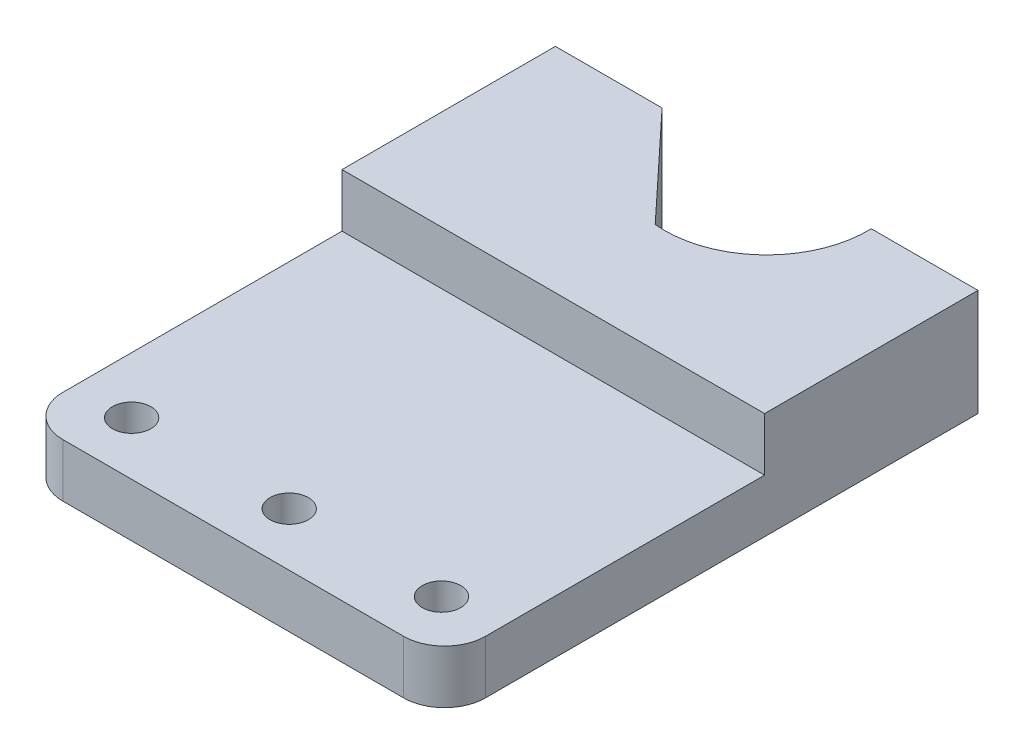
ISO-10303-21;
HEADER;
FILE_DESCRIPTION(('STEP AP214'),'2;1');
FILE_NAME('part.step','',(''),(''),'','','');
FILE_SCHEMA(('AUTOMOTIVE_DESIGN { 1 0 10303 214 1 1 1 1 }'));
ENDSEC;
DATA;
#1=APPLICATION_CONTEXT('core data for automotive mechanical design processes');
#2=APPLICATION_PROTOCOL_DEFINITION('international standard','automotive_design',2000,#1);
#3=PRODUCT_CONTEXT('',#1,'mechanical');
#4=PRODUCT('Part','Part','',(#3));
#5=PRODUCT_RELATED_PRODUCT_CATEGORY('part','',(#4));
#6=PRODUCT_DEFINITION_FORMATION('','',#4);
#7=PRODUCT_DEFINITION_CONTEXT('part definition',#1,'design');
#8=PRODUCT_DEFINITION('design','',#6,#7);
#9=PRODUCT_DEFINITION_SHAPE('','',#8);
#10=(LENGTH_UNIT() NAMED_UNIT(*) SI_UNIT(.MILLI.,.METRE.));
#11=(NAMED_UNIT(*) PLANE_ANGLE_UNIT() SI_UNIT($,.RADIAN.));
#12=(NAMED_UNIT(*) SI_UNIT($,.STERADIAN.) SOLID_ANGLE_UNIT());
#13=UNCERTAINTY_MEASURE_WITH_UNIT(LENGTH_MEASURE(1.E-05),#10,'distance_accuracy_value','');
#14=(GEOMETRIC_REPRESENTATION_CONTEXT(3) GLOBAL_UNCERTAINTY_ASSIGNED_CONTEXT((#13)) GLOBAL_UNIT_ASSIGNED_CONTEXT((#10,
#11,#12)) REPRESENTATION_CONTEXT('',''));
#15=CARTESIAN_POINT('',(0.,0.,0.));
#16=DIRECTION('',(0.,0.,1.));
#17=DIRECTION('',(1.,0.,0.));
#18=AXIS2_PLACEMENT_3D('',#15,#16,#17);
#19=CARTESIAN_POINT('',(-259.020883507789,12.7,-132.766492393178));
#20=DIRECTION('',(0.,-1.,0.));
#21=DIRECTION('',(0.,0.,-1.));
#22=AXIS2_PLACEMENT_3D('',#19,#20,#21);
#23=CYLINDRICAL_SURFACE('',#22,4.87);
#24=DIRECTION('',(0.,-1.,0.));
#25=VECTOR('',#24,1.);
#26=CARTESIAN_POINT('',(-254.150883507789,12.7,-132.766492393178));
#27=LINE('',#26,#25);
#28=CARTESIAN_POINT('',(-254.150883507789,6.35,-132.766492393178));
#29=VERTEX_POINT('',#28);
#30=CARTESIAN_POINT('',(-254.150883507789,0.,-132.766492393178));
#31=VERTEX_POINT('',#30);
#32=EDGE_CURVE('E225',#29,#31,#27,.T.);
#33=ORIENTED_EDGE('',*,*,#32,.F.);
#34=CARTESIAN_POINT('',(-259.020883507789,6.35,-132.766492393178));
#35=DIRECTION('',(0.,1.,0.));
#36=DIRECTION('',(0.,0.,1.));
#37=AXIS2_PLACEMENT_3D('',#34,#35,#36);
#38=CIRCLE('',#37,4.87);
#39=CARTESIAN_POINT('',(-259.020883507789,6.35,-127.896492393178));
#40=VERTEX_POINT('',#39);
#41=EDGE_CURVE('E48',#29,#40,#38,.F.);
#42=ORIENTED_EDGE('',*,*,#41,.T.);
#43=DIRECTION('',(0.,-1.,0.));
#44=VECTOR('',#43,1.);
#45=CARTESIAN_POINT('',(-259.020883507789,12.7,-127.896492393178));
#46=LINE('',#45,#44);
#47=CARTESIAN_POINT('',(-259.020883507789,0.,-127.896492393178));
#48=VERTEX_POINT('',#47);
#49=EDGE_CURVE('E41',#48,#40,#46,.F.);
#50=ORIENTED_EDGE('',*,*,#49,.F.);
#51=CARTESIAN_POINT('',(-259.020883507789,0.,-132.766492393178));
#52=DIRECTION('',(0.,1.,0.));
#53=DIRECTION('',(0.,0.,1.));
#54=AXIS2_PLACEMENT_3D('',#51,#52,#53);
#55=CIRCLE('',#54,4.87);
#56=EDGE_CURVE('E11',#31,#48,#55,.F.);
#57=ORIENTED_EDGE('',*,*,#56,.F.);
#58=EDGE_LOOP('',(#33,#42,#50,#57));
#59=FACE_BOUND('',#58,.T.);
#60=ADVANCED_FACE('F33',(#59),#23,.T.);
#61=CARTESIAN_POINT('',(-299.585501553445,12.7,-132.766492393178));
#62=DIRECTION('',(0.,1.,0.));
#63=DIRECTION('',(0.,0.,1.));
#64=AXIS2_PLACEMENT_3D('',#61,#62,#63);
#65=CYLINDRICAL_SURFACE('',#64,4.87);
#66=DIRECTION('',(0.,1.,0.));
#67=VECTOR('',#66,1.);
#68=CARTESIAN_POINT('',(-299.585501553445,12.7,-127.896492393178));
#69=LINE('',#68,#67);
#70=CARTESIAN_POINT('',(-299.585501553445,6.35,-127.896492393178));
#71=VERTEX_POINT('',#70);
#72=CARTESIAN_POINT('',(-299.585501553445,0.,-127.896492393178));
#73=VERTEX_POINT('',#72);
#74=EDGE_CURVE('E221',#71,#73,#69,.F.);
#75=ORIENTED_EDGE('',*,*,#74,.F.);
#76=CARTESIAN_POINT('',(-299.585501553445,6.35,-132.766492393178));
#77=DIRECTION('',(0.,1.,0.));
#78=DIRECTION('',(0.,0.,1.));
#79=AXIS2_PLACEMENT_3D('',#76,#77,#78);
#80=CIRCLE('',#79,4.87);
#81=CARTESIAN_POINT('',(-304.455501553445,6.35,-132.766492393178));
#82=VERTEX_POINT('',#81);
#83=EDGE_CURVE('E148',#71,#82,#80,.F.);
#84=ORIENTED_EDGE('',*,*,#83,.T.);
#85=DIRECTION('',(0.,1.,0.));
#86=VECTOR('',#85,1.);
#87=CARTESIAN_POINT('',(-304.455501553445,12.7,-132.766492393178));
#88=LINE('',#87,#86);
#89=CARTESIAN_POINT('',(-304.455501553445,0.,-132.766492393178));
#90=VERTEX_POINT('',#89);
#91=EDGE_CURVE('E218',#90,#82,#88,.T.);
#92=ORIENTED_EDGE('',*,*,#91,.F.);
#93=CARTESIAN_POINT('',(-299.585501553445,0.,-132.766492393178));
#94=DIRECTION('',(0.,1.,0.));
#95=DIRECTION('',(0.,0.,1.));
#96=AXIS2_PLACEMENT_3D('',#93,#94,#95);
#97=CIRCLE('',#96,4.87);
#98=EDGE_CURVE('E223',#73,#90,#97,.F.);
#99=ORIENTED_EDGE('',*,*,#98,.F.);
#100=EDGE_LOOP('',(#75,#84,#92,#99));
#101=FACE_BOUND('',#100,.T.);
#102=ADVANCED_FACE('F259',(#101),#65,.T.);
#103=CARTESIAN_POINT('',(-304.455501553445,12.7,-127.896492393178));
#104=DIRECTION('',(0.,0.,-1.));
#105=DIRECTION('',(-1.,0.,0.));
#106=AXIS2_PLACEMENT_3D('',#103,#104,#105);
#107=PLANE('',#106);
#108=DIRECTION('',(1.,0.,0.));
#109=VECTOR('',#108,1.);
#110=CARTESIAN_POINT('',(-304.455501553445,6.35,-127.896492393178));
#111=LINE('',#110,#109);
#112=EDGE_CURVE('E136',#71,#40,#111,.T.);
#113=ORIENTED_EDGE('',*,*,#112,.F.);
#114=ORIENTED_EDGE('',*,*,#74,.T.);
#115=DIRECTION('',(1.,0.,0.));
#116=VECTOR('',#115,1.);
#117=CARTESIAN_POINT('',(-304.455501553445,0.,-127.896492393178));
#118=LINE('',#117,#116);
#119=EDGE_CURVE('E194',#73,#48,#118,.T.);
#120=ORIENTED_EDGE('',*,*,#119,.T.);
#121=ORIENTED_EDGE('',*,*,#49,.T.);
#122=EDGE_LOOP('',(#113,#114,#120,#121));
#123=FACE_BOUND('',#122,.T.);
#124=ADVANCED_FACE('F230',(#123),#107,.F.);
#125=CARTESIAN_POINT('',(-297.746130931016,12.7,-134.246492393178));
#126=DIRECTION('',(0.,-1.,0.));
#127=DIRECTION('',(0.,0.,-1.));
#128=AXIS2_PLACEMENT_3D('',#125,#126,#127);
#129=CYLINDRICAL_SURFACE('',#128,2.28600000000004);
#130=CARTESIAN_POINT('',(-297.746130931016,0.,-134.246492393178));
#131=DIRECTION('',(0.,1.,0.));
#132=DIRECTION('',(0.,0.,1.));
#133=AXIS2_PLACEMENT_3D('',#130,#131,#132);
#134=CIRCLE('',#133,2.28600000000004);
#135=CARTESIAN_POINT('',(-297.746130931016,0.,-131.960492393178));
#136=VERTEX_POINT('',#135);
#137=EDGE_CURVE('E170',#136,#136,#134,.T.);
#138=ORIENTED_EDGE('',*,*,#137,.F.);
#139=EDGE_LOOP('',(#138));
#140=FACE_BOUND('',#139,.T.);
#141=CARTESIAN_POINT('',(-297.746130931016,6.35,-134.246492393178));
#142=DIRECTION('',(0.,1.,0.));
#143=DIRECTION('',(0.,0.,1.));
#144=AXIS2_PLACEMENT_3D('',#141,#142,#143);
#145=CIRCLE('',#144,2.28600000000004);
#146=CARTESIAN_POINT('',(-297.746130931016,6.35,-131.960492393178));
#147=VERTEX_POINT('',#146);
#148=EDGE_CURVE('E145',#147,#147,#145,.T.);
#149=ORIENTED_EDGE('',*,*,#148,.T.);
#150=EDGE_LOOP('',(#149));
#151=FACE_BOUND('',#150,.T.);
#152=ADVANCED_FACE('F281',(#140,#151),#129,.F.);
#153=CARTESIAN_POINT('',(-278.990383135221,12.7,-134.246492393178));
#154=DIRECTION('',(0.,-1.,0.));
#155=DIRECTION('',(0.,0.,-1.));
#156=AXIS2_PLACEMENT_3D('',#153,#154,#155);
#157=CYLINDRICAL_SURFACE('',#156,2.28600000000028);
#158=CARTESIAN_POINT('',(-278.990383135221,0.,-134.246492393178));
#159=DIRECTION('',(0.,1.,0.));
#160=DIRECTION('',(0.,0.,1.));
#161=AXIS2_PLACEMENT_3D('',#158,#159,#160);
#162=CIRCLE('',#161,2.28600000000028);
#163=CARTESIAN_POINT('',(-278.990383135221,0.,-131.960492393178));
#164=VERTEX_POINT('',#163);
#165=EDGE_CURVE('E167',#164,#164,#162,.T.);
#166=ORIENTED_EDGE('',*,*,#165,.F.);
#167=EDGE_LOOP('',(#166));
#168=FACE_BOUND('',#167,.T.);
#169=CARTESIAN_POINT('',(-278.990383135221,6.35,-134.246492393178));
#170=DIRECTION('',(0.,1.,0.));
#171=DIRECTION('',(0.,0.,1.));
#172=AXIS2_PLACEMENT_3D('',#169,#170,#171);
#173=CIRCLE('',#172,2.28600000000028);
#174=CARTESIAN_POINT('',(-278.990383135221,6.35,-131.960492393178));
#175=VERTEX_POINT('',#174);
#176=EDGE_CURVE('E142',#175,#175,#173,.T.);
#177=ORIENTED_EDGE('',*,*,#176,.T.);
#178=EDGE_LOOP('',(#177));
#179=FACE_BOUND('',#178,.T.);
#180=ADVANCED_FACE('F286',(#168,#179),#157,.F.);
#181=CARTESIAN_POINT('',(-260.860254130218,12.7,-134.246492393178));
#182=DIRECTION('',(0.,-1.,0.));
#183=DIRECTION('',(0.,0.,-1.));
#184=AXIS2_PLACEMENT_3D('',#181,#182,#183);
#185=CYLINDRICAL_SURFACE('',#184,2.2860000000005);
#186=CARTESIAN_POINT('',(-260.860254130218,0.,-134.246492393178));
#187=DIRECTION('',(0.,1.,0.));
#188=DIRECTION('',(0.,0.,1.));
#189=AXIS2_PLACEMENT_3D('',#186,#187,#188);
#190=CIRCLE('',#189,2.2860000000005);
#191=CARTESIAN_POINT('',(-260.860254130218,0.,-131.960492393178));
#192=VERTEX_POINT('',#191);
#193=EDGE_CURVE('E156',#192,#192,#190,.T.);
#194=ORIENTED_EDGE('',*,*,#193,.F.);
#195=EDGE_LOOP('',(#194));
#196=FACE_BOUND('',#195,.T.);
#197=CARTESIAN_POINT('',(-260.860254130218,6.35,-134.246492393178));
#198=DIRECTION('',(0.,1.,0.));
#199=DIRECTION('',(0.,0.,1.));
#200=AXIS2_PLACEMENT_3D('',#197,#198,#199);
#201=CIRCLE('',#200,2.2860000000005);
#202=CARTESIAN_POINT('',(-260.860254130218,6.35,-131.960492393178));
#203=VERTEX_POINT('',#202);
#204=EDGE_CURVE('E36',#203,#203,#201,.T.);
#205=ORIENTED_EDGE('',*,*,#204,.T.);
#206=EDGE_LOOP('',(#205));
#207=FACE_BOUND('',#206,.T.);
#208=ADVANCED_FACE('F301',(#196,#207),#185,.F.);
#209=CARTESIAN_POINT('',(-278.944798511906,12.7,-191.012799973147));
#210=DIRECTION('',(0.,1.,0.));
#211=DIRECTION('',(0.,0.,1.));
#212=AXIS2_PLACEMENT_3D('',#209,#210,#211);
#213=PLANE('',#212);
#214=DIRECTION('',(-1.,0.,0.));
#215=VECTOR('',#214,1.);
#216=CARTESIAN_POINT('',(-254.150883507789,12.7,-165.996492393178));
#217=LINE('',#216,#215);
#218=CARTESIAN_POINT('',(-254.150883507789,12.7,-165.996492393178));
#219=VERTEX_POINT('',#218);
#220=CARTESIAN_POINT('',(-304.455501553445,12.7,-165.996492393178));
#221=VERTEX_POINT('',#220);
#222=EDGE_CURVE('E122',#219,#221,#217,.T.);
#223=ORIENTED_EDGE('',*,*,#222,.F.);
#224=DIRECTION('',(0.,0.,-1.));
#225=VECTOR('',#224,1.);
#226=CARTESIAN_POINT('',(-254.150883507789,12.7,-127.896492393178));
#227=LINE('',#226,#225);
#228=CARTESIAN_POINT('',(-254.150883507789,12.7,-191.396492393178));
#229=VERTEX_POINT('',#228);
#230=EDGE_CURVE('E135',#219,#229,#227,.T.);
#231=ORIENTED_EDGE('',*,*,#230,.T.);
#232=DIRECTION('',(-1.,0.,0.));
#233=VECTOR('',#232,1.);
#234=CARTESIAN_POINT('',(-266.850883507789,12.7,-191.396492393178));
#235=LINE('',#234,#233);
#236=CARTESIAN_POINT('',(-266.850883507789,12.7,-191.396492393178));
#237=VERTEX_POINT('',#236);
#238=EDGE_CURVE('E182',#229,#237,#235,.T.);
#239=ORIENTED_EDGE('',*,*,#238,.T.);
#240=CARTESIAN_POINT('',(-278.944798511906,12.7,-191.012799973147));
#241=DIRECTION('',(0.,-1.,0.));
#242=DIRECTION('',(0.,0.,1.));
#243=AXIS2_PLACEMENT_3D('',#240,#241,#242);
#244=CIRCLE('',#243,12.1);
#245=CARTESIAN_POINT('',(-280.151228021918,12.7,-178.97309367119));
#246=VERTEX_POINT('',#245);
#247=EDGE_CURVE('E184',#237,#246,#244,.T.);
#248=ORIENTED_EDGE('',*,*,#247,.T.);
#249=DIRECTION('',(-0.682604325383957,0.,-0.730788160116948));
#250=VECTOR('',#249,1.);
#251=CARTESIAN_POINT('',(-291.755501553445,12.7,-191.396492393178));
#252=LINE('',#251,#250);
#253=CARTESIAN_POINT('',(-291.755501553445,12.7,-191.396492393178));
#254=VERTEX_POINT('',#253);
#255=EDGE_CURVE('E186',#246,#254,#252,.T.);
#256=ORIENTED_EDGE('',*,*,#255,.T.);
#257=DIRECTION('',(-1.,0.,0.));
#258=VECTOR('',#257,1.);
#259=CARTESIAN_POINT('',(-291.755501553445,12.7,-191.396492393178));
#260=LINE('',#259,#258);
#261=CARTESIAN_POINT('',(-304.455501553445,12.7,-191.396492393178));
#262=VERTEX_POINT('',#261);
#263=EDGE_CURVE('E174',#254,#262,#260,.T.);
#264=ORIENTED_EDGE('',*,*,#263,.T.);
#265=DIRECTION('',(0.,0.,1.));
#266=VECTOR('',#265,1.);
#267=CARTESIAN_POINT('',(-304.455501553445,12.7,-191.396492393178));
#268=LINE('',#267,#266);
#269=EDGE_CURVE('E177',#262,#221,#268,.T.);
#270=ORIENTED_EDGE('',*,*,#269,.T.);
#271=EDGE_LOOP('',(#223,#231,#239,#248,#256,#264,#270));
#272=FACE_BOUND('',#271,.T.);
#273=ADVANCED_FACE('F253',(#272),#213,.T.);
#274=CARTESIAN_POINT('',(-278.944798511906,0.,-191.012799973147));
#275=DIRECTION('',(0.,1.,0.));
#276=DIRECTION('',(0.,0.,1.));
#277=AXIS2_PLACEMENT_3D('',#274,#275,#276);
#278=PLANE('',#277);
#279=DIRECTION('',(0.,0.,-1.));
#280=VECTOR('',#279,1.);
#281=CARTESIAN_POINT('',(-254.150883507789,0.,-127.896492393178));
#282=LINE('',#281,#280);
#283=CARTESIAN_POINT('',(-254.150883507789,0.,-191.396492393178));
#284=VERTEX_POINT('',#283);
#285=EDGE_CURVE('E197',#31,#284,#282,.T.);
#286=ORIENTED_EDGE('',*,*,#285,.F.);
#287=ORIENTED_EDGE('',*,*,#56,.T.);
#288=ORIENTED_EDGE('',*,*,#119,.F.);
#289=ORIENTED_EDGE('',*,*,#98,.T.);
#290=DIRECTION('',(0.,0.,1.));
#291=VECTOR('',#290,1.);
#292=CARTESIAN_POINT('',(-304.455501553445,0.,-191.396492393178));
#293=LINE('',#292,#291);
#294=CARTESIAN_POINT('',(-304.455501553445,0.,-191.396492393178));
#295=VERTEX_POINT('',#294);
#296=EDGE_CURVE('E191',#295,#90,#293,.T.);
#297=ORIENTED_EDGE('',*,*,#296,.F.);
#298=DIRECTION('',(-1.,0.,0.));
#299=VECTOR('',#298,1.);
#300=CARTESIAN_POINT('',(-291.755501553445,0.,-191.396492393178));
#301=LINE('',#300,#299);
#302=CARTESIAN_POINT('',(-291.755501553445,0.,-191.396492393178));
#303=VERTEX_POINT('',#302);
#304=EDGE_CURVE('E173',#303,#295,#301,.T.);
#305=ORIENTED_EDGE('',*,*,#304,.F.);
#306=DIRECTION('',(-0.682604325383957,0.,-0.730788160116948));
#307=VECTOR('',#306,1.);
#308=CARTESIAN_POINT('',(-291.755501553445,0.,-191.396492393178));
#309=LINE('',#308,#307);
#310=CARTESIAN_POINT('',(-280.151228021918,0.,-178.97309367119));
#311=VERTEX_POINT('',#310);
#312=EDGE_CURVE('E178',#311,#303,#309,.T.);
#313=ORIENTED_EDGE('',*,*,#312,.F.);
#314=CARTESIAN_POINT('',(-278.944798511906,0.,-191.012799973147));
#315=DIRECTION('',(0.,-1.,0.));
#316=DIRECTION('',(0.,0.,1.));
#317=AXIS2_PLACEMENT_3D('',#314,#315,#316);
#318=CIRCLE('',#317,12.1);
#319=CARTESIAN_POINT('',(-266.850883507789,0.,-191.396492393178));
#320=VERTEX_POINT('',#319);
#321=EDGE_CURVE('E201',#320,#311,#318,.T.);
#322=ORIENTED_EDGE('',*,*,#321,.F.);
#323=DIRECTION('',(-1.,0.,0.));
#324=VECTOR('',#323,1.);
#325=CARTESIAN_POINT('',(-266.850883507789,0.,-191.396492393178));
#326=LINE('',#325,#324);
#327=EDGE_CURVE('E199',#284,#320,#326,.T.);
#328=ORIENTED_EDGE('',*,*,#327,.F.);
#329=EDGE_LOOP('',(#286,#287,#288,#289,#297,#305,#313,#322,#328));
#330=FACE_BOUND('',#329,.T.);
#331=ORIENTED_EDGE('',*,*,#137,.T.);
#332=EDGE_LOOP('',(#331));
#333=FACE_BOUND('',#332,.T.);
#334=ORIENTED_EDGE('',*,*,#165,.T.);
#335=EDGE_LOOP('',(#334));
#336=FACE_BOUND('',#335,.T.);
#337=ORIENTED_EDGE('',*,*,#193,.T.);
#338=EDGE_LOOP('',(#337));
#339=FACE_BOUND('',#338,.T.);
#340=ADVANCED_FACE('F239',(#330,#333,#336,#339),#278,.F.);
#341=CARTESIAN_POINT('',(-291.755501553445,12.7,-191.396492393178));
#342=DIRECTION('',(0.,0.,1.));
#343=DIRECTION('',(1.,0.,0.));
#344=AXIS2_PLACEMENT_3D('',#341,#342,#343);
#345=PLANE('',#344);
#346=CARTESIAN_POINT('',(-298.105501553445,6.35,-191.396492393178));
#347=DIRECTION('',(0.,0.,-1.));
#348=DIRECTION('',(-1.,0.,0.));
#349=AXIS2_PLACEMENT_3D('',#346,#347,#348);
#350=CIRCLE('',#349,2.28600000000004);
#351=CARTESIAN_POINT('',(-300.391501553445,6.35,-191.396492393178));
#352=VERTEX_POINT('',#351);
#353=EDGE_CURVE('E152',#352,#352,#350,.T.);
#354=ORIENTED_EDGE('',*,*,#353,.F.);
#355=EDGE_LOOP('',(#354));
#356=FACE_BOUND('',#355,.T.);
#357=ORIENTED_EDGE('',*,*,#304,.T.);
#358=DIRECTION('',(0.,-1.,0.));
#359=VECTOR('',#358,1.);
#360=CARTESIAN_POINT('',(-304.455501553445,12.7,-191.396492393178));
#361=LINE('',#360,#359);
#362=EDGE_CURVE('E215',#262,#295,#361,.T.);
#363=ORIENTED_EDGE('',*,*,#362,.F.);
#364=ORIENTED_EDGE('',*,*,#263,.F.);
#365=DIRECTION('',(0.,-1.,0.));
#366=VECTOR('',#365,1.);
#367=CARTESIAN_POINT('',(-291.755501553445,12.7,-191.396492393178));
#368=LINE('',#367,#366);
#369=EDGE_CURVE('E188',#254,#303,#368,.T.);
#370=ORIENTED_EDGE('',*,*,#369,.T.);
#371=EDGE_LOOP('',(#357,#363,#364,#370));
#372=FACE_BOUND('',#371,.T.);
#373=ADVANCED_FACE('F263',(#356,#372),#345,.F.);
#374=CARTESIAN_POINT('',(-304.455501553445,12.7,-191.396492393178));
#375=DIRECTION('',(1.,0.,0.));
#376=DIRECTION('',(0.,0.,-1.));
#377=AXIS2_PLACEMENT_3D('',#374,#375,#376);
#378=PLANE('',#377);
#379=DIRECTION('',(0.,0.,1.));
#380=VECTOR('',#379,1.);
#381=CARTESIAN_POINT('',(-304.455501553445,6.35,-165.996492393178));
#382=LINE('',#381,#380);
#383=CARTESIAN_POINT('',(-304.455501553445,6.35,-165.996492393178));
#384=VERTEX_POINT('',#383);
#385=EDGE_CURVE('E130',#384,#82,#382,.T.);
#386=ORIENTED_EDGE('',*,*,#385,.F.);
#387=DIRECTION('',(0.,1.,0.));
#388=VECTOR('',#387,1.);
#389=CARTESIAN_POINT('',(-304.455501553445,6.35,-165.996492393178));
#390=LINE('',#389,#388);
#391=EDGE_CURVE('E129',#384,#221,#390,.T.);
#392=ORIENTED_EDGE('',*,*,#391,.T.);
#393=ORIENTED_EDGE('',*,*,#269,.F.);
#394=ORIENTED_EDGE('',*,*,#362,.T.);
#395=ORIENTED_EDGE('',*,*,#296,.T.);
#396=ORIENTED_EDGE('',*,*,#91,.T.);
#397=EDGE_LOOP('',(#386,#392,#393,#394,#395,#396));
#398=FACE_BOUND('',#397,.T.);
#399=ADVANCED_FACE('F261',(#398),#378,.F.);
#400=CARTESIAN_POINT('',(-254.150883507789,12.7,-127.896492393178));
#401=DIRECTION('',(-1.,0.,0.));
#402=DIRECTION('',(0.,0.,1.));
#403=AXIS2_PLACEMENT_3D('',#400,#401,#402);
#404=PLANE('',#403);
#405=ORIENTED_EDGE('',*,*,#230,.F.);
#406=DIRECTION('',(0.,1.,0.));
#407=VECTOR('',#406,1.);
#408=CARTESIAN_POINT('',(-254.150883507789,6.35,-165.996492393178));
#409=LINE('',#408,#407);
#410=CARTESIAN_POINT('',(-254.150883507789,6.35,-165.996492393178));
#411=VERTEX_POINT('',#410);
#412=EDGE_CURVE('E126',#411,#219,#409,.T.);
#413=ORIENTED_EDGE('',*,*,#412,.F.);
#414=DIRECTION('',(0.,0.,-1.));
#415=VECTOR('',#414,1.);
#416=CARTESIAN_POINT('',(-254.150883507789,6.35,-127.896492393178));
#417=LINE('',#416,#415);
#418=EDGE_CURVE('E114',#29,#411,#417,.T.);
#419=ORIENTED_EDGE('',*,*,#418,.F.);
#420=ORIENTED_EDGE('',*,*,#32,.T.);
#421=ORIENTED_EDGE('',*,*,#285,.T.);
#422=DIRECTION('',(0.,-1.,0.));
#423=VECTOR('',#422,1.);
#424=CARTESIAN_POINT('',(-254.150883507789,12.7,-191.396492393178));
#425=LINE('',#424,#423);
#426=EDGE_CURVE('E212',#229,#284,#425,.T.);
#427=ORIENTED_EDGE('',*,*,#426,.F.);
#428=EDGE_LOOP('',(#405,#413,#419,#420,#421,#427));
#429=FACE_BOUND('',#428,.T.);
#430=ADVANCED_FACE('F133',(#429),#404,.F.);
#431=CARTESIAN_POINT('',(-266.850883507789,12.7,-191.396492393178));
#432=DIRECTION('',(0.,0.,1.));
#433=DIRECTION('',(1.,0.,0.));
#434=AXIS2_PLACEMENT_3D('',#431,#432,#433);
#435=PLANE('',#434);
#436=CARTESIAN_POINT('',(-260.500883507789,6.35,-191.396492393178));
#437=DIRECTION('',(0.,0.,-1.));
#438=DIRECTION('',(-1.,0.,0.));
#439=AXIS2_PLACEMENT_3D('',#436,#437,#438);
#440=CIRCLE('',#439,2.28600000000004);
#441=CARTESIAN_POINT('',(-262.786883507789,6.35,-191.396492393178));
#442=VERTEX_POINT('',#441);
#443=EDGE_CURVE('E157',#442,#442,#440,.T.);
#444=ORIENTED_EDGE('',*,*,#443,.F.);
#445=EDGE_LOOP('',(#444));
#446=FACE_BOUND('',#445,.T.);
#447=ORIENTED_EDGE('',*,*,#327,.T.);
#448=DIRECTION('',(0.,-1.,0.));
#449=VECTOR('',#448,1.);
#450=CARTESIAN_POINT('',(-266.850883507789,12.7,-191.396492393178));
#451=LINE('',#450,#449);
#452=EDGE_CURVE('E209',#237,#320,#451,.T.);
#453=ORIENTED_EDGE('',*,*,#452,.F.);
#454=ORIENTED_EDGE('',*,*,#238,.F.);
#455=ORIENTED_EDGE('',*,*,#426,.T.);
#456=EDGE_LOOP('',(#447,#453,#454,#455));
#457=FACE_BOUND('',#456,.T.);
#458=ADVANCED_FACE('F236',(#446,#457),#435,.F.);
#459=CARTESIAN_POINT('',(-278.944798511906,12.7,-191.012799973147));
#460=DIRECTION('',(0.,-1.,0.));
#461=DIRECTION('',(0.,0.,-1.));
#462=AXIS2_PLACEMENT_3D('',#459,#460,#461);
#463=CYLINDRICAL_SURFACE('',#462,12.1);
#464=ORIENTED_EDGE('',*,*,#321,.T.);
#465=DIRECTION('',(0.,-1.,0.));
#466=VECTOR('',#465,1.);
#467=CARTESIAN_POINT('',(-280.151228021918,12.7,-178.97309367119));
#468=LINE('',#467,#466);
#469=EDGE_CURVE('E206',#246,#311,#468,.T.);
#470=ORIENTED_EDGE('',*,*,#469,.F.);
#471=ORIENTED_EDGE('',*,*,#247,.F.);
#472=ORIENTED_EDGE('',*,*,#452,.T.);
#473=EDGE_LOOP('',(#464,#470,#471,#472));
#474=FACE_BOUND('',#473,.T.);
#475=ADVANCED_FACE('F245',(#474),#463,.F.);
#476=CARTESIAN_POINT('',(-291.755501553445,12.7,-191.396492393178));
#477=DIRECTION('',(-0.730788160116947,0.,0.682604325383957));
#478=DIRECTION('',(0.682604325383957,0.,0.730788160116948));
#479=AXIS2_PLACEMENT_3D('',#476,#477,#478);
#480=PLANE('',#479);
#481=ORIENTED_EDGE('',*,*,#312,.T.);
#482=ORIENTED_EDGE('',*,*,#369,.F.);
#483=ORIENTED_EDGE('',*,*,#255,.F.);
#484=ORIENTED_EDGE('',*,*,#469,.T.);
#485=EDGE_LOOP('',(#481,#482,#483,#484));
#486=FACE_BOUND('',#485,.T.);
#487=ADVANCED_FACE('F249',(#486),#480,.F.);
#488=CARTESIAN_POINT('',(-260.500883507789,6.35,-178.696492393178));
#489=DIRECTION('',(0.,0.,-1.));
#490=DIRECTION('',(-1.,0.,0.));
#491=AXIS2_PLACEMENT_3D('',#488,#489,#490);
#492=CYLINDRICAL_SURFACE('',#491,2.28600000000004);
#493=CARTESIAN_POINT('',(-260.500883507789,6.35,-178.696492393178));
#494=DIRECTION('',(0.,0.,-1.));
#495=DIRECTION('',(-1.,0.,0.));
#496=AXIS2_PLACEMENT_3D('',#493,#494,#495);
#497=CIRCLE('',#496,2.28600000000004);
#498=CARTESIAN_POINT('',(-262.786883507789,6.35,-178.696492393178));
#499=VERTEX_POINT('',#498);
#500=EDGE_CURVE('E153',#499,#499,#497,.T.);
#501=ORIENTED_EDGE('',*,*,#500,.F.);
#502=EDGE_LOOP('',(#501));
#503=FACE_BOUND('',#502,.T.);
#504=ORIENTED_EDGE('',*,*,#443,.T.);
#505=EDGE_LOOP('',(#504));
#506=FACE_BOUND('',#505,.T.);
#507=ADVANCED_FACE('F298',(#503,#506),#492,.F.);
#508=CARTESIAN_POINT('',(-260.500883507789,6.35,-178.696492393178));
#509=DIRECTION('',(0.,0.,-1.));
#510=DIRECTION('',(-1.,0.,0.));
#511=AXIS2_PLACEMENT_3D('',#508,#509,#510);
#512=PLANE('',#511);
#513=ORIENTED_EDGE('',*,*,#500,.T.);
#514=EDGE_LOOP('',(#513));
#515=FACE_BOUND('',#514,.T.);
#516=ADVANCED_FACE('F313',(#515),#512,.T.);
#517=CARTESIAN_POINT('',(-298.105501553445,6.35,-178.696492393178));
#518=DIRECTION('',(0.,0.,-1.));
#519=DIRECTION('',(-1.,0.,0.));
#520=AXIS2_PLACEMENT_3D('',#517,#518,#519);
#521=CYLINDRICAL_SURFACE('',#520,2.28600000000004);
#522=CARTESIAN_POINT('',(-298.105501553445,6.35,-178.696492393178));
#523=DIRECTION('',(0.,0.,-1.));
#524=DIRECTION('',(-1.,0.,0.));
#525=AXIS2_PLACEMENT_3D('',#522,#523,#524);
#526=CIRCLE('',#525,2.28600000000004);
#527=CARTESIAN_POINT('',(-300.391501553445,6.35,-178.696492393178));
#528=VERTEX_POINT('',#527);
#529=EDGE_CURVE('E160',#528,#528,#526,.T.);
#530=ORIENTED_EDGE('',*,*,#529,.F.);
#531=EDGE_LOOP('',(#530));
#532=FACE_BOUND('',#531,.T.);
#533=ORIENTED_EDGE('',*,*,#353,.T.);
#534=EDGE_LOOP('',(#533));
#535=FACE_BOUND('',#534,.T.);
#536=ADVANCED_FACE('F309',(#532,#535),#521,.F.);
#537=CARTESIAN_POINT('',(-298.105501553445,6.35,-178.696492393178));
#538=DIRECTION('',(0.,0.,-1.));
#539=DIRECTION('',(-1.,0.,0.));
#540=AXIS2_PLACEMENT_3D('',#537,#538,#539);
#541=PLANE('',#540);
#542=ORIENTED_EDGE('',*,*,#529,.T.);
#543=EDGE_LOOP('',(#542));
#544=FACE_BOUND('',#543,.T.);
#545=ADVANCED_FACE('F312',(#544),#541,.T.);
#546=CARTESIAN_POINT('',(-254.150883507789,6.35,-165.996492393178));
#547=DIRECTION('',(0.,0.,-1.));
#548=DIRECTION('',(-1.,0.,0.));
#549=AXIS2_PLACEMENT_3D('',#546,#547,#548);
#550=PLANE('',#549);
#551=ORIENTED_EDGE('',*,*,#222,.T.);
#552=ORIENTED_EDGE('',*,*,#391,.F.);
#553=DIRECTION('',(-1.,0.,0.));
#554=VECTOR('',#553,1.);
#555=CARTESIAN_POINT('',(-254.150883507789,6.35,-165.996492393178));
#556=LINE('',#555,#554);
#557=EDGE_CURVE('E117',#411,#384,#556,.T.);
#558=ORIENTED_EDGE('',*,*,#557,.F.);
#559=ORIENTED_EDGE('',*,*,#412,.T.);
#560=EDGE_LOOP('',(#551,#552,#558,#559));
#561=FACE_BOUND('',#560,.T.);
#562=ADVANCED_FACE('F125',(#561),#550,.F.);
#563=CARTESIAN_POINT('',(0.,6.35,0.));
#564=DIRECTION('',(0.,1.,0.));
#565=DIRECTION('',(0.,0.,1.));
#566=AXIS2_PLACEMENT_3D('',#563,#564,#565);
#567=PLANE('',#566);
#568=ORIENTED_EDGE('',*,*,#148,.F.);
#569=EDGE_LOOP('',(#568));
#570=FACE_BOUND('',#569,.T.);
#571=ORIENTED_EDGE('',*,*,#176,.F.);
#572=EDGE_LOOP('',(#571));
#573=FACE_BOUND('',#572,.T.);
#574=ORIENTED_EDGE('',*,*,#204,.F.);
#575=EDGE_LOOP('',(#574));
#576=FACE_BOUND('',#575,.T.);
#577=ORIENTED_EDGE('',*,*,#418,.T.);
#578=ORIENTED_EDGE('',*,*,#557,.T.);
#579=ORIENTED_EDGE('',*,*,#385,.T.);
#580=ORIENTED_EDGE('',*,*,#83,.F.);
#581=ORIENTED_EDGE('',*,*,#112,.T.);
#582=ORIENTED_EDGE('',*,*,#41,.F.);
#583=EDGE_LOOP('',(#577,#578,#579,#580,#581,#582));
#584=FACE_BOUND('',#583,.T.);
#585=ADVANCED_FACE('F116',(#570,#573,#576,#584),#567,.T.);
#586=CLOSED_SHELL('',(#60,#102,#124,#152,#180,#208,#273,#340,#373,#399,#430,#458,#475,#487,#507,
#516,#536,#545,#562,#585));
#587=MANIFOLD_SOLID_BREP('B2',#586);
#588=ADVANCED_BREP_SHAPE_REPRESENTATION('',(#18,#587),#14);
#589=SHAPE_DEFINITION_REPRESENTATION(#9,#588);
ENDSEC;
END-ISO-10303-21;
